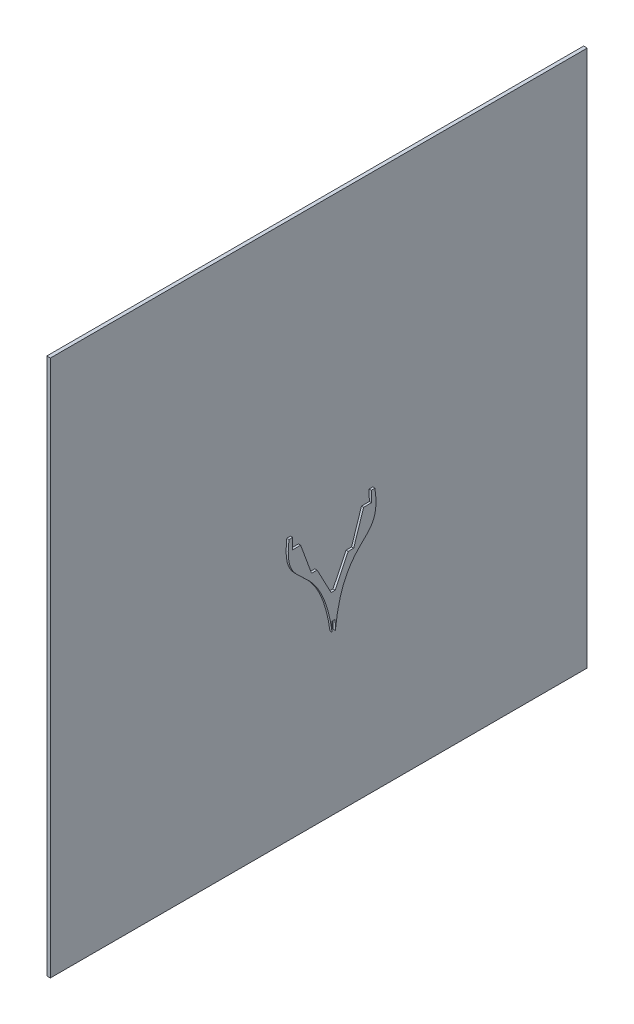
ISO-10303-21;
HEADER;
FILE_DESCRIPTION(('STEP AP214'),'2;1');
FILE_NAME('part.step','',(''),(''),'','','');
FILE_SCHEMA(('AUTOMOTIVE_DESIGN { 1 0 10303 214 1 1 1 1 }'));
ENDSEC;
DATA;
#1=APPLICATION_CONTEXT('core data for automotive mechanical design processes');
#2=APPLICATION_PROTOCOL_DEFINITION('international standard','automotive_design',2000,#1);
#3=PRODUCT_CONTEXT('',#1,'mechanical');
#4=PRODUCT('Part','Part','',(#3));
#5=PRODUCT_RELATED_PRODUCT_CATEGORY('part','',(#4));
#6=PRODUCT_DEFINITION_FORMATION('','',#4);
#7=PRODUCT_DEFINITION_CONTEXT('part definition',#1,'design');
#8=PRODUCT_DEFINITION('design','',#6,#7);
#9=PRODUCT_DEFINITION_SHAPE('','',#8);
#10=(LENGTH_UNIT() NAMED_UNIT(*) SI_UNIT(.MILLI.,.METRE.));
#11=(NAMED_UNIT(*) PLANE_ANGLE_UNIT() SI_UNIT($,.RADIAN.));
#12=(NAMED_UNIT(*) SI_UNIT($,.STERADIAN.) SOLID_ANGLE_UNIT());
#13=UNCERTAINTY_MEASURE_WITH_UNIT(LENGTH_MEASURE(1.E-05),#10,'distance_accuracy_value','');
#14=(GEOMETRIC_REPRESENTATION_CONTEXT(3) GLOBAL_UNCERTAINTY_ASSIGNED_CONTEXT((#13)) GLOBAL_UNIT_ASSIGNED_CONTEXT((#10,
#11,#12)) REPRESENTATION_CONTEXT('',''));
#15=CARTESIAN_POINT('',(0.,0.,0.));
#16=DIRECTION('',(0.,0.,1.));
#17=DIRECTION('',(1.,0.,0.));
#18=AXIS2_PLACEMENT_3D('',#15,#16,#17);
#19=CARTESIAN_POINT('',(6.,364.853833294932,126.645128026185));
#20=CARTESIAN_POINT('',(6.,189.198989555926,148.13035540186));
#21=CARTESIAN_POINT('',(6.,339.317071991358,6.14685676845281));
#22=CARTESIAN_POINT('',(6.,42.0883154100208,0.762445711713081));
#23=CARTESIAN_POINT('',(6.,0.,0.));
#24=B_SPLINE_CURVE_WITH_KNOTS('',4,(#19,#20,#21,#22,#23),.UNSPECIFIED.,.F.,.F.,(5,5),(0.,1.),.UNSPECIFIED.);
#25=DIRECTION('',(-1.,0.,0.));
#26=VECTOR('',#25,1.);
#27=SURFACE_OF_LINEAR_EXTRUSION('',#24,#26);
#28=CARTESIAN_POINT('',(0.,364.853833294932,126.645128026185));
#29=CARTESIAN_POINT('',(0.,189.198989555926,148.13035540186));
#30=CARTESIAN_POINT('',(0.,339.317071991358,6.14685676845281));
#31=CARTESIAN_POINT('',(0.,42.0883154100208,0.762445711713081));
#32=CARTESIAN_POINT('',(0.,0.,0.));
#33=B_SPLINE_CURVE_WITH_KNOTS('',4,(#28,#29,#30,#31,#32),.UNSPECIFIED.,.F.,.F.,(5,5),(0.,1.),.UNSPECIFIED.);
#34=CARTESIAN_POINT('',(0.,364.853833294932,126.645128026185));
#35=VERTEX_POINT('',#34);
#36=CARTESIAN_POINT('',(0.,79.9870890347289,5.95047304447543));
#37=VERTEX_POINT('',#36);
#38=EDGE_CURVE('E191',#35,#37,#33,.T.);
#39=ORIENTED_EDGE('',*,*,#38,.T.);
#40=DIRECTION('',(1.,0.,0.));
#41=VECTOR('',#40,1.);
#42=CARTESIAN_POINT('',(0.,79.9870890347289,5.95047304447543));
#43=LINE('',#42,#41);
#44=CARTESIAN_POINT('',(6.,79.9870890347289,5.95047304447543));
#45=VERTEX_POINT('',#44);
#46=EDGE_CURVE('E197',#37,#45,#43,.T.);
#47=ORIENTED_EDGE('',*,*,#46,.T.);
#48=CARTESIAN_POINT('',(6.,364.853833294932,126.645128026185));
#49=VERTEX_POINT('',#48);
#50=EDGE_CURVE('E231',#49,#45,#24,.T.);
#51=ORIENTED_EDGE('',*,*,#50,.F.);
#52=DIRECTION('',(-1.,0.,0.));
#53=VECTOR('',#52,1.);
#54=CARTESIAN_POINT('',(6.,364.853833294932,126.645128026185));
#55=LINE('',#54,#53);
#56=EDGE_CURVE('E187',#49,#35,#55,.T.);
#57=ORIENTED_EDGE('',*,*,#56,.T.);
#58=EDGE_LOOP('',(#39,#47,#51,#57));
#59=FACE_BOUND('',#58,.T.);
#60=ADVANCED_FACE('F45',(#59),#27,.F.);
#61=CARTESIAN_POINT('',(6.,0.,0.));
#62=CARTESIAN_POINT('',(6.,42.0883154100208,0.762445711713081));
#63=CARTESIAN_POINT('',(6.,339.317071991358,6.14685676845281));
#64=CARTESIAN_POINT('',(6.,194.439966493917,-141.180590983));
#65=CARTESIAN_POINT('',(6.,369.201389216786,-113.347440743804));
#66=B_SPLINE_CURVE_WITH_KNOTS('',4,(#61,#62,#63,#64,#65),.UNSPECIFIED.,.F.,.F.,(5,5),(0.,1.),.UNSPECIFIED.);
#67=DIRECTION('',(-1.,0.,0.));
#68=VECTOR('',#67,1.);
#69=SURFACE_OF_LINEAR_EXTRUSION('',#66,#68);
#70=CARTESIAN_POINT('',(6.,80.150127430031,-3.04952695552456));
#71=VERTEX_POINT('',#70);
#72=CARTESIAN_POINT('',(6.,369.201389216786,-113.347440743804));
#73=VERTEX_POINT('',#72);
#74=EDGE_CURVE('E128',#71,#73,#66,.T.);
#75=ORIENTED_EDGE('',*,*,#74,.F.);
#76=DIRECTION('',(1.,0.,0.));
#77=VECTOR('',#76,1.);
#78=CARTESIAN_POINT('',(0.,80.150127430031,-3.04952695552456));
#79=LINE('',#78,#77);
#80=CARTESIAN_POINT('',(0.,80.150127430031,-3.04952695552456));
#81=VERTEX_POINT('',#80);
#82=EDGE_CURVE('E323',#81,#71,#79,.T.);
#83=ORIENTED_EDGE('',*,*,#82,.F.);
#84=CARTESIAN_POINT('',(0.,0.,0.));
#85=CARTESIAN_POINT('',(0.,42.0883154100208,0.762445711713081));
#86=CARTESIAN_POINT('',(0.,339.317071991358,6.14685676845281));
#87=CARTESIAN_POINT('',(0.,194.439966493917,-141.180590983));
#88=CARTESIAN_POINT('',(0.,369.201389216786,-113.347440743804));
#89=B_SPLINE_CURVE_WITH_KNOTS('',4,(#84,#85,#86,#87,#88),.UNSPECIFIED.,.F.,.F.,(5,5),(0.,1.),.UNSPECIFIED.);
#90=CARTESIAN_POINT('',(0.,369.201389216786,-113.347440743804));
#91=VERTEX_POINT('',#90);
#92=EDGE_CURVE('E196',#81,#91,#89,.T.);
#93=ORIENTED_EDGE('',*,*,#92,.T.);
#94=DIRECTION('',(-1.,0.,0.));
#95=VECTOR('',#94,1.);
#96=CARTESIAN_POINT('',(6.,369.201389216786,-113.347440743804));
#97=LINE('',#96,#95);
#98=EDGE_CURVE('E13',#73,#91,#97,.T.);
#99=ORIENTED_EDGE('',*,*,#98,.F.);
#100=EDGE_LOOP('',(#75,#83,#93,#99));
#101=FACE_BOUND('',#100,.T.);
#102=ADVANCED_FACE('F335',(#101),#69,.F.);
#103=CARTESIAN_POINT('',(6.,369.201389216786,-113.347440743804));
#104=DIRECTION('',(0.,-0.999835956927465,-0.0181124055536444));
#105=DIRECTION('',(0.,0.0181124055536444,-0.999835956927465));
#106=AXIS2_PLACEMENT_3D('',#103,#104,#105);
#107=PLANE('',#106);
#108=DIRECTION('',(0.,-0.0181124055536444,0.999835956927465));
#109=VECTOR('',#108,1.);
#110=CARTESIAN_POINT('',(0.,369.201389216786,-113.347440743804));
#111=LINE('',#110,#109);
#112=CARTESIAN_POINT('',(0.,369.020235444228,-103.347440743804));
#113=VERTEX_POINT('',#112);
#114=EDGE_CURVE('E204',#91,#113,#111,.T.);
#115=ORIENTED_EDGE('',*,*,#114,.T.);
#116=DIRECTION('',(-1.,0.,0.));
#117=VECTOR('',#116,1.);
#118=CARTESIAN_POINT('',(6.,369.020235444228,-103.347440743804));
#119=LINE('',#118,#117);
#120=CARTESIAN_POINT('',(6.,369.020235444228,-103.347440743804));
#121=VERTEX_POINT('',#120);
#122=EDGE_CURVE('E53',#121,#113,#119,.T.);
#123=ORIENTED_EDGE('',*,*,#122,.F.);
#124=DIRECTION('',(0.,-0.0181124055536444,0.999835956927465));
#125=VECTOR('',#124,1.);
#126=CARTESIAN_POINT('',(6.,369.201389216786,-113.347440743804));
#127=LINE('',#126,#125);
#128=EDGE_CURVE('E317',#73,#121,#127,.T.);
#129=ORIENTED_EDGE('',*,*,#128,.F.);
#130=ORIENTED_EDGE('',*,*,#98,.T.);
#131=EDGE_LOOP('',(#115,#123,#129,#130));
#132=FACE_BOUND('',#131,.T.);
#133=ADVANCED_FACE('F338',(#132),#107,.F.);
#134=CARTESIAN_POINT('',(6.,369.020235444228,-103.347440743804));
#135=DIRECTION('',(0.,0.0160870411099661,-0.999870595181359));
#136=DIRECTION('',(0.,0.99987059518136,0.0160870411099661));
#137=AXIS2_PLACEMENT_3D('',#134,#135,#136);
#138=PLANE('',#137);
#139=DIRECTION('',(0.,-0.99987059518136,-0.0160870411099661));
#140=VECTOR('',#139,1.);
#141=CARTESIAN_POINT('',(0.,369.020235444228,-103.347440743804));
#142=LINE('',#141,#140);
#143=CARTESIAN_POINT('',(0.,338.725486256645,-103.834856693374));
#144=VERTEX_POINT('',#143);
#145=EDGE_CURVE('E209',#113,#144,#142,.T.);
#146=ORIENTED_EDGE('',*,*,#145,.T.);
#147=DIRECTION('',(-1.,0.,0.));
#148=VECTOR('',#147,1.);
#149=CARTESIAN_POINT('',(6.,338.725486256645,-103.834856693374));
#150=LINE('',#149,#148);
#151=CARTESIAN_POINT('',(6.,338.725486256645,-103.834856693374));
#152=VERTEX_POINT('',#151);
#153=EDGE_CURVE('E256',#152,#144,#150,.T.);
#154=ORIENTED_EDGE('',*,*,#153,.F.);
#155=DIRECTION('',(0.,-0.99987059518136,-0.0160870411099661));
#156=VECTOR('',#155,1.);
#157=CARTESIAN_POINT('',(6.,369.020235444228,-103.347440743804));
#158=LINE('',#157,#156);
#159=EDGE_CURVE('E265',#121,#152,#158,.T.);
#160=ORIENTED_EDGE('',*,*,#159,.F.);
#161=ORIENTED_EDGE('',*,*,#122,.T.);
#162=EDGE_LOOP('',(#146,#154,#160,#161));
#163=FACE_BOUND('',#162,.T.);
#164=ADVANCED_FACE('F263',(#163),#138,.F.);
#165=CARTESIAN_POINT('',(6.,338.725486256645,-103.834856693374));
#166=DIRECTION('',(0.,-0.999835956927465,-0.0181124055536395));
#167=DIRECTION('',(0.,0.0181124055536395,-0.999835956927465));
#168=AXIS2_PLACEMENT_3D('',#165,#166,#167);
#169=PLANE('',#168);
#170=DIRECTION('',(0.,-0.0181124055536395,0.999835956927465));
#171=VECTOR('',#170,1.);
#172=CARTESIAN_POINT('',(0.,338.725486256645,-103.834856693374));
#173=LINE('',#172,#171);
#174=CARTESIAN_POINT('',(0.,338.329231694482,-81.9609229315815));
#175=VERTEX_POINT('',#174);
#176=EDGE_CURVE('E211',#144,#175,#173,.T.);
#177=ORIENTED_EDGE('',*,*,#176,.T.);
#178=DIRECTION('',(-1.,0.,0.));
#179=VECTOR('',#178,1.);
#180=CARTESIAN_POINT('',(6.,338.329231694482,-81.9609229315815));
#181=LINE('',#180,#179);
#182=CARTESIAN_POINT('',(6.,338.329231694482,-81.9609229315815));
#183=VERTEX_POINT('',#182);
#184=EDGE_CURVE('E253',#183,#175,#181,.T.);
#185=ORIENTED_EDGE('',*,*,#184,.F.);
#186=DIRECTION('',(0.,-0.0181124055536395,0.999835956927465));
#187=VECTOR('',#186,1.);
#188=CARTESIAN_POINT('',(6.,338.725486256645,-103.834856693374));
#189=LINE('',#188,#187);
#190=EDGE_CURVE('E287',#152,#183,#189,.T.);
#191=ORIENTED_EDGE('',*,*,#190,.F.);
#192=ORIENTED_EDGE('',*,*,#153,.T.);
#193=EDGE_LOOP('',(#177,#185,#191,#192));
#194=FACE_BOUND('',#193,.T.);
#195=ADVANCED_FACE('F278',(#194),#169,.F.);
#196=CARTESIAN_POINT('',(6.,338.329231694482,-81.9609229315815));
#197=DIRECTION('',(0.,-0.311111308267552,-0.950373481252529));
#198=DIRECTION('',(0.,0.95037348125253,-0.311111308267552));
#199=AXIS2_PLACEMENT_3D('',#196,#197,#198);
#200=PLANE('',#199);
#201=DIRECTION('',(0.,-0.95037348125253,0.311111308267552));
#202=VECTOR('',#201,1.);
#203=CARTESIAN_POINT('',(0.,338.329231694482,-81.9609229315815));
#204=LINE('',#203,#202);
#205=CARTESIAN_POINT('',(0.,253.603564510284,-54.2253919203654));
#206=VERTEX_POINT('',#205);
#207=EDGE_CURVE('E213',#175,#206,#204,.T.);
#208=ORIENTED_EDGE('',*,*,#207,.T.);
#209=DIRECTION('',(-1.,0.,0.));
#210=VECTOR('',#209,1.);
#211=CARTESIAN_POINT('',(6.,253.603564510284,-54.2253919203654));
#212=LINE('',#211,#210);
#213=CARTESIAN_POINT('',(6.,253.603564510284,-54.2253919203654));
#214=VERTEX_POINT('',#213);
#215=EDGE_CURVE('E250',#214,#206,#212,.T.);
#216=ORIENTED_EDGE('',*,*,#215,.F.);
#217=DIRECTION('',(0.,-0.95037348125253,0.311111308267552));
#218=VECTOR('',#217,1.);
#219=CARTESIAN_POINT('',(6.,338.329231694482,-81.9609229315815));
#220=LINE('',#219,#218);
#221=EDGE_CURVE('E284',#183,#214,#220,.T.);
#222=ORIENTED_EDGE('',*,*,#221,.F.);
#223=ORIENTED_EDGE('',*,*,#184,.T.);
#224=EDGE_LOOP('',(#208,#216,#222,#223));
#225=FACE_BOUND('',#224,.T.);
#226=ADVANCED_FACE('F282',(#225),#200,.F.);
#227=CARTESIAN_POINT('',(6.,253.603564510284,-54.2253919203654));
#228=DIRECTION('',(0.,-0.999835956927465,-0.0181124055536461));
#229=DIRECTION('',(0.,0.0181124055536461,-0.999835956927465));
#230=AXIS2_PLACEMENT_3D('',#227,#228,#229);
#231=PLANE('',#230);
#232=DIRECTION('',(0.,-0.0181124055536461,0.999835956927465));
#233=VECTOR('',#232,1.);
#234=CARTESIAN_POINT('',(0.,253.603564510284,-54.2253919203654));
#235=LINE('',#234,#233);
#236=CARTESIAN_POINT('',(0.,253.325986756832,-38.9026222351012));
#237=VERTEX_POINT('',#236);
#238=EDGE_CURVE('E215',#206,#237,#235,.T.);
#239=ORIENTED_EDGE('',*,*,#238,.T.);
#240=DIRECTION('',(-1.,0.,0.));
#241=VECTOR('',#240,1.);
#242=CARTESIAN_POINT('',(6.,253.325986756832,-38.9026222351012));
#243=LINE('',#242,#241);
#244=CARTESIAN_POINT('',(6.,253.325986756832,-38.9026222351012));
#245=VERTEX_POINT('',#244);
#246=EDGE_CURVE('E247',#245,#237,#243,.T.);
#247=ORIENTED_EDGE('',*,*,#246,.F.);
#248=DIRECTION('',(0.,-0.0181124055536461,0.999835956927465));
#249=VECTOR('',#248,1.);
#250=CARTESIAN_POINT('',(6.,253.603564510284,-54.2253919203654));
#251=LINE('',#250,#249);
#252=EDGE_CURVE('E286',#214,#245,#251,.T.);
#253=ORIENTED_EDGE('',*,*,#252,.F.);
#254=ORIENTED_EDGE('',*,*,#215,.T.);
#255=EDGE_LOOP('',(#239,#247,#253,#254));
#256=FACE_BOUND('',#255,.T.);
#257=ADVANCED_FACE('F348',(#256),#231,.F.);
#258=CARTESIAN_POINT('',(6.,253.325986756832,-38.9026222351012));
#259=DIRECTION('',(0.,-0.435133768076451,-0.90036581669874));
#260=DIRECTION('',(0.,0.90036581669874,-0.435133768076451));
#261=AXIS2_PLACEMENT_3D('',#258,#259,#260);
#262=PLANE('',#261);
#263=DIRECTION('',(0.,-0.90036581669874,0.435133768076451));
#264=VECTOR('',#263,1.);
#265=CARTESIAN_POINT('',(0.,253.325986756832,-38.9026222351012));
#266=LINE('',#265,#264);
#267=CARTESIAN_POINT('',(0.,177.902642332424,-2.45161148854171));
#268=VERTEX_POINT('',#267);
#269=EDGE_CURVE('E217',#237,#268,#266,.T.);
#270=ORIENTED_EDGE('',*,*,#269,.T.);
#271=DIRECTION('',(-1.,0.,0.));
#272=VECTOR('',#271,1.);
#273=CARTESIAN_POINT('',(6.,177.902642332424,-2.45161148854171));
#274=LINE('',#273,#272);
#275=CARTESIAN_POINT('',(6.,177.902642332424,-2.45161148854171));
#276=VERTEX_POINT('',#275);
#277=EDGE_CURVE('E244',#276,#268,#274,.T.);
#278=ORIENTED_EDGE('',*,*,#277,.F.);
#279=DIRECTION('',(0.,-0.90036581669874,0.435133768076451));
#280=VECTOR('',#279,1.);
#281=CARTESIAN_POINT('',(6.,253.325986756832,-38.9026222351012));
#282=LINE('',#281,#280);
#283=EDGE_CURVE('E289',#245,#276,#282,.T.);
#284=ORIENTED_EDGE('',*,*,#283,.F.);
#285=ORIENTED_EDGE('',*,*,#246,.T.);
#286=EDGE_LOOP('',(#270,#278,#284,#285));
#287=FACE_BOUND('',#286,.T.);
#288=ADVANCED_FACE('F351',(#287),#262,.F.);
#289=CARTESIAN_POINT('',(6.,177.902642332424,-2.45161148854171));
#290=DIRECTION('',(0.,-0.999835956927465,-0.0181124055536434));
#291=DIRECTION('',(0.,0.0181124055536434,-0.999835956927466));
#292=AXIS2_PLACEMENT_3D('',#289,#290,#291);
#293=PLANE('',#292);
#294=DIRECTION('',(0.,-0.0181124055536434,0.999835956927466));
#295=VECTOR('',#294,1.);
#296=CARTESIAN_POINT('',(0.,177.902642332424,-2.45161148854171));
#297=LINE('',#296,#295);
#298=CARTESIAN_POINT('',(0.,177.697122528397,8.89343538106488));
#299=VERTEX_POINT('',#298);
#300=EDGE_CURVE('E219',#268,#299,#297,.T.);
#301=ORIENTED_EDGE('',*,*,#300,.T.);
#302=DIRECTION('',(-1.,0.,0.));
#303=VECTOR('',#302,1.);
#304=CARTESIAN_POINT('',(6.,177.697122528397,8.89343538106488));
#305=LINE('',#304,#303);
#306=CARTESIAN_POINT('',(6.,177.697122528397,8.89343538106488));
#307=VERTEX_POINT('',#306);
#308=EDGE_CURVE('E241',#307,#299,#305,.T.);
#309=ORIENTED_EDGE('',*,*,#308,.F.);
#310=DIRECTION('',(0.,-0.0181124055536434,0.999835956927466));
#311=VECTOR('',#310,1.);
#312=CARTESIAN_POINT('',(6.,177.902642332424,-2.45161148854171));
#313=LINE('',#312,#311);
#314=EDGE_CURVE('E295',#276,#307,#313,.T.);
#315=ORIENTED_EDGE('',*,*,#314,.F.);
#316=ORIENTED_EDGE('',*,*,#277,.T.);
#317=EDGE_LOOP('',(#301,#309,#315,#316));
#318=FACE_BOUND('',#317,.T.);
#319=ADVANCED_FACE('F355',(#318),#293,.F.);
#320=CARTESIAN_POINT('',(6.,251.750765932059,48.0522781531887));
#321=DIRECTION('',(0.,-0.467458500051491,0.884015017253446));
#322=DIRECTION('',(0.,-0.884015017253446,-0.467458500051491));
#323=AXIS2_PLACEMENT_3D('',#320,#321,#322);
#324=PLANE('',#323);
#325=DIRECTION('',(0.,0.884015017253446,0.467458500051491));
#326=VECTOR('',#325,1.);
#327=CARTESIAN_POINT('',(0.,251.750765932059,48.0522781531887));
#328=LINE('',#327,#326);
#329=CARTESIAN_POINT('',(0.,251.750765932059,48.0522781531887));
#330=VERTEX_POINT('',#329);
#331=EDGE_CURVE('E221',#299,#330,#328,.T.);
#332=ORIENTED_EDGE('',*,*,#331,.T.);
#333=DIRECTION('',(-1.,0.,0.));
#334=VECTOR('',#333,1.);
#335=CARTESIAN_POINT('',(6.,251.750765932059,48.0522781531887));
#336=LINE('',#335,#334);
#337=CARTESIAN_POINT('',(6.,251.750765932059,48.0522781531887));
#338=VERTEX_POINT('',#337);
#339=EDGE_CURVE('E238',#338,#330,#336,.T.);
#340=ORIENTED_EDGE('',*,*,#339,.F.);
#341=DIRECTION('',(0.,0.884015017253446,0.467458500051491));
#342=VECTOR('',#341,1.);
#343=CARTESIAN_POINT('',(6.,251.750765932059,48.0522781531887));
#344=LINE('',#343,#342);
#345=EDGE_CURVE('E297',#307,#338,#344,.T.);
#346=ORIENTED_EDGE('',*,*,#345,.F.);
#347=ORIENTED_EDGE('',*,*,#308,.T.);
#348=EDGE_LOOP('',(#332,#340,#346,#347));
#349=FACE_BOUND('',#348,.T.);
#350=ADVANCED_FACE('F359',(#349),#324,.F.);
#351=CARTESIAN_POINT('',(6.,251.473188178607,63.3750478384528));
#352=DIRECTION('',(0.,-0.999835956927465,-0.0181124055536425));
#353=DIRECTION('',(0.,0.0181124055536425,-0.999835956927466));
#354=AXIS2_PLACEMENT_3D('',#351,#352,#353);
#355=PLANE('',#354);
#356=DIRECTION('',(0.,-0.0181124055536425,0.999835956927465));
#357=VECTOR('',#356,1.);
#358=CARTESIAN_POINT('',(0.,251.473188178607,63.3750478384528));
#359=LINE('',#358,#357);
#360=CARTESIAN_POINT('',(0.,251.473188178607,63.3750478384528));
#361=VERTEX_POINT('',#360);
#362=EDGE_CURVE('E223',#330,#361,#359,.T.);
#363=ORIENTED_EDGE('',*,*,#362,.T.);
#364=DIRECTION('',(-1.,0.,0.));
#365=VECTOR('',#364,1.);
#366=CARTESIAN_POINT('',(6.,251.473188178607,63.3750478384528));
#367=LINE('',#366,#365);
#368=CARTESIAN_POINT('',(6.,251.473188178607,63.3750478384528));
#369=VERTEX_POINT('',#368);
#370=EDGE_CURVE('E235',#369,#361,#367,.T.);
#371=ORIENTED_EDGE('',*,*,#370,.F.);
#372=DIRECTION('',(0.,-0.0181124055536425,0.999835956927465));
#373=VECTOR('',#372,1.);
#374=CARTESIAN_POINT('',(6.,251.473188178607,63.3750478384528));
#375=LINE('',#374,#373);
#376=EDGE_CURVE('E299',#338,#369,#375,.T.);
#377=ORIENTED_EDGE('',*,*,#376,.F.);
#378=ORIENTED_EDGE('',*,*,#339,.T.);
#379=EDGE_LOOP('',(#363,#371,#377,#378));
#380=FACE_BOUND('',#379,.T.);
#381=ADVANCED_FACE('F305',(#380),#355,.F.);
#382=CARTESIAN_POINT('',(6.,335.138715732283,94.1610488688984));
#383=DIRECTION('',(0.,-0.34532863470452,0.938481824039822));
#384=DIRECTION('',(0.,-0.938481824039823,-0.34532863470452));
#385=AXIS2_PLACEMENT_3D('',#382,#383,#384);
#386=PLANE('',#385);
#387=DIRECTION('',(0.,0.938481824039822,0.34532863470452));
#388=VECTOR('',#387,1.);
#389=CARTESIAN_POINT('',(0.,335.138715732283,94.1610488688984));
#390=LINE('',#389,#388);
#391=CARTESIAN_POINT('',(0.,335.138715732283,94.1610488688984));
#392=VERTEX_POINT('',#391);
#393=EDGE_CURVE('E225',#361,#392,#390,.T.);
#394=ORIENTED_EDGE('',*,*,#393,.T.);
#395=DIRECTION('',(-1.,0.,0.));
#396=VECTOR('',#395,1.);
#397=CARTESIAN_POINT('',(6.,335.138715732283,94.1610488688984));
#398=LINE('',#397,#396);
#399=CARTESIAN_POINT('',(6.,335.138715732283,94.1610488688984));
#400=VERTEX_POINT('',#399);
#401=EDGE_CURVE('E182',#400,#392,#398,.T.);
#402=ORIENTED_EDGE('',*,*,#401,.F.);
#403=DIRECTION('',(0.,0.938481824039822,0.34532863470452));
#404=VECTOR('',#403,1.);
#405=CARTESIAN_POINT('',(6.,335.138715732283,94.1610488688984));
#406=LINE('',#405,#404);
#407=EDGE_CURVE('E170',#369,#400,#406,.T.);
#408=ORIENTED_EDGE('',*,*,#407,.F.);
#409=ORIENTED_EDGE('',*,*,#370,.T.);
#410=EDGE_LOOP('',(#394,#402,#408,#409));
#411=FACE_BOUND('',#410,.T.);
#412=ADVANCED_FACE('F309',(#411),#386,.F.);
#413=CARTESIAN_POINT('',(6.,334.74246117012,116.034982630691));
#414=DIRECTION('',(0.,-0.999835956927465,-0.0181124055536446));
#415=DIRECTION('',(0.,0.0181124055536446,-0.999835956927465));
#416=AXIS2_PLACEMENT_3D('',#413,#414,#415);
#417=PLANE('',#416);
#418=DIRECTION('',(0.,-0.0181124055536446,0.999835956927465));
#419=VECTOR('',#418,1.);
#420=CARTESIAN_POINT('',(0.,334.74246117012,116.034982630691));
#421=LINE('',#420,#419);
#422=CARTESIAN_POINT('',(0.,334.74246117012,116.034982630691));
#423=VERTEX_POINT('',#422);
#424=EDGE_CURVE('E179',#392,#423,#421,.T.);
#425=ORIENTED_EDGE('',*,*,#424,.T.);
#426=DIRECTION('',(-1.,0.,0.));
#427=VECTOR('',#426,1.);
#428=CARTESIAN_POINT('',(6.,334.74246117012,116.034982630691));
#429=LINE('',#428,#427);
#430=CARTESIAN_POINT('',(6.,334.74246117012,116.034982630691));
#431=VERTEX_POINT('',#430);
#432=EDGE_CURVE('E176',#431,#423,#429,.T.);
#433=ORIENTED_EDGE('',*,*,#432,.F.);
#434=DIRECTION('',(0.,-0.0181124055536446,0.999835956927465));
#435=VECTOR('',#434,1.);
#436=CARTESIAN_POINT('',(6.,334.74246117012,116.034982630691));
#437=LINE('',#436,#435);
#438=EDGE_CURVE('E163',#400,#431,#437,.T.);
#439=ORIENTED_EDGE('',*,*,#438,.F.);
#440=ORIENTED_EDGE('',*,*,#401,.T.);
#441=EDGE_LOOP('',(#425,#433,#439,#440));
#442=FACE_BOUND('',#441,.T.);
#443=ADVANCED_FACE('F177',(#442),#417,.F.);
#444=CARTESIAN_POINT('',(6.,365.03498706749,116.645128026186));
#445=DIRECTION('',(0.,-0.0201376956766726,0.999797216045751));
#446=DIRECTION('',(0.,-0.999797216045751,-0.0201376956766726));
#447=AXIS2_PLACEMENT_3D('',#444,#445,#446);
#448=PLANE('',#447);
#449=DIRECTION('',(0.,0.999797216045751,0.0201376956766726));
#450=VECTOR('',#449,1.);
#451=CARTESIAN_POINT('',(0.,365.03498706749,116.645128026186));
#452=LINE('',#451,#450);
#453=CARTESIAN_POINT('',(0.,365.03498706749,116.645128026186));
#454=VERTEX_POINT('',#453);
#455=EDGE_CURVE('E228',#423,#454,#452,.T.);
#456=ORIENTED_EDGE('',*,*,#455,.T.);
#457=DIRECTION('',(-1.,0.,0.));
#458=VECTOR('',#457,1.);
#459=CARTESIAN_POINT('',(6.,365.03498706749,116.645128026186));
#460=LINE('',#459,#458);
#461=CARTESIAN_POINT('',(6.,365.03498706749,116.645128026186));
#462=VERTEX_POINT('',#461);
#463=EDGE_CURVE('E183',#462,#454,#460,.T.);
#464=ORIENTED_EDGE('',*,*,#463,.F.);
#465=DIRECTION('',(0.,0.999797216045751,0.0201376956766726));
#466=VECTOR('',#465,1.);
#467=CARTESIAN_POINT('',(6.,365.03498706749,116.645128026186));
#468=LINE('',#467,#466);
#469=EDGE_CURVE('E167',#431,#462,#468,.T.);
#470=ORIENTED_EDGE('',*,*,#469,.F.);
#471=ORIENTED_EDGE('',*,*,#432,.T.);
#472=EDGE_LOOP('',(#456,#464,#470,#471));
#473=FACE_BOUND('',#472,.T.);
#474=ADVANCED_FACE('F185',(#473),#448,.F.);
#475=CARTESIAN_POINT('',(6.,364.853833294932,126.645128026185));
#476=DIRECTION('',(0.,-0.999835956927465,-0.0181124055536447));
#477=DIRECTION('',(0.,0.0181124055536447,-0.999835956927465));
#478=AXIS2_PLACEMENT_3D('',#475,#476,#477);
#479=PLANE('',#478);
#480=DIRECTION('',(0.,-0.0181124055536447,0.999835956927465));
#481=VECTOR('',#480,1.);
#482=CARTESIAN_POINT('',(0.,364.853833294932,126.645128026185));
#483=LINE('',#482,#481);
#484=EDGE_CURVE('E120',#454,#35,#483,.T.);
#485=ORIENTED_EDGE('',*,*,#484,.T.);
#486=ORIENTED_EDGE('',*,*,#56,.F.);
#487=DIRECTION('',(0.,-0.0181124055536447,0.999835956927465));
#488=VECTOR('',#487,1.);
#489=CARTESIAN_POINT('',(6.,364.853833294932,126.645128026185));
#490=LINE('',#489,#488);
#491=EDGE_CURVE('E69',#462,#49,#490,.T.);
#492=ORIENTED_EDGE('',*,*,#491,.F.);
#493=ORIENTED_EDGE('',*,*,#463,.T.);
#494=EDGE_LOOP('',(#485,#486,#492,#493));
#495=FACE_BOUND('',#494,.T.);
#496=ADVANCED_FACE('F311',(#495),#479,.F.);
#497=CARTESIAN_POINT('',(6.,207.869092819179,47.4435920681996));
#498=DIRECTION('',(-1.,0.,0.));
#499=DIRECTION('',(0.,0.,1.));
#500=AXIS2_PLACEMENT_3D('',#497,#498,#499);
#501=PLANE('',#500);
#502=ORIENTED_EDGE('',*,*,#50,.T.);
#503=DIRECTION('',(0.,-0.999835956927465,-0.0181124055536429));
#504=VECTOR('',#503,1.);
#505=CARTESIAN_POINT('',(6.,79.9870890347289,5.95047304447543));
#506=LINE('',#505,#504);
#507=CARTESIAN_POINT('',(6.,106.987089034729,6.43958823038171));
#508=VERTEX_POINT('',#507);
#509=EDGE_CURVE('E511',#508,#45,#506,.T.);
#510=ORIENTED_EDGE('',*,*,#509,.F.);
#511=DIRECTION('',(0.,-0.0181124055536438,0.999835956927465));
#512=VECTOR('',#511,1.);
#513=CARTESIAN_POINT('',(6.,106.987089034729,6.43958823038171));
#514=LINE('',#513,#512);
#515=CARTESIAN_POINT('',(6.,107.150127430031,-2.56041176961829));
#516=VERTEX_POINT('',#515);
#517=EDGE_CURVE('E519',#516,#508,#514,.T.);
#518=ORIENTED_EDGE('',*,*,#517,.F.);
#519=DIRECTION('',(0.,0.999835956927465,0.0181124055536428));
#520=VECTOR('',#519,1.);
#521=CARTESIAN_POINT('',(6.,107.150127430031,-2.56041176961829));
#522=LINE('',#521,#520);
#523=EDGE_CURVE('E523',#71,#516,#522,.T.);
#524=ORIENTED_EDGE('',*,*,#523,.F.);
#525=ORIENTED_EDGE('',*,*,#74,.T.);
#526=ORIENTED_EDGE('',*,*,#128,.T.);
#527=ORIENTED_EDGE('',*,*,#159,.T.);
#528=ORIENTED_EDGE('',*,*,#190,.T.);
#529=ORIENTED_EDGE('',*,*,#221,.T.);
#530=ORIENTED_EDGE('',*,*,#252,.T.);
#531=ORIENTED_EDGE('',*,*,#283,.T.);
#532=ORIENTED_EDGE('',*,*,#314,.T.);
#533=ORIENTED_EDGE('',*,*,#345,.T.);
#534=ORIENTED_EDGE('',*,*,#376,.T.);
#535=ORIENTED_EDGE('',*,*,#407,.T.);
#536=ORIENTED_EDGE('',*,*,#438,.T.);
#537=ORIENTED_EDGE('',*,*,#469,.T.);
#538=ORIENTED_EDGE('',*,*,#491,.T.);
#539=EDGE_LOOP('',(#502,#510,#518,#524,#525,#526,#527,#528,#529,#530,#531,#532,#533,#534,#535,
#536,#537,#538));
#540=FACE_BOUND('',#539,.T.);
#541=ADVANCED_FACE('F165',(#540),#501,.F.);
#542=CARTESIAN_POINT('',(0.,207.869092819179,47.4435920681996));
#543=DIRECTION('',(-1.,0.,0.));
#544=DIRECTION('',(0.,0.,1.));
#545=AXIS2_PLACEMENT_3D('',#542,#543,#544);
#546=PLANE('',#545);
#547=DIRECTION('',(0.,-0.999835956927465,-0.0181124055536429));
#548=VECTOR('',#547,1.);
#549=CARTESIAN_POINT('',(0.,79.9870890347289,5.95047304447543));
#550=LINE('',#549,#548);
#551=CARTESIAN_POINT('',(0.,106.987089034729,6.43958823038171));
#552=VERTEX_POINT('',#551);
#553=EDGE_CURVE('E532',#552,#37,#550,.T.);
#554=ORIENTED_EDGE('',*,*,#553,.T.);
#555=ORIENTED_EDGE('',*,*,#38,.F.);
#556=ORIENTED_EDGE('',*,*,#484,.F.);
#557=ORIENTED_EDGE('',*,*,#455,.F.);
#558=ORIENTED_EDGE('',*,*,#424,.F.);
#559=ORIENTED_EDGE('',*,*,#393,.F.);
#560=ORIENTED_EDGE('',*,*,#362,.F.);
#561=ORIENTED_EDGE('',*,*,#331,.F.);
#562=ORIENTED_EDGE('',*,*,#300,.F.);
#563=ORIENTED_EDGE('',*,*,#269,.F.);
#564=ORIENTED_EDGE('',*,*,#238,.F.);
#565=ORIENTED_EDGE('',*,*,#207,.F.);
#566=ORIENTED_EDGE('',*,*,#176,.F.);
#567=ORIENTED_EDGE('',*,*,#145,.F.);
#568=ORIENTED_EDGE('',*,*,#114,.F.);
#569=ORIENTED_EDGE('',*,*,#92,.F.);
#570=DIRECTION('',(0.,0.999835956927465,0.0181124055536428));
#571=VECTOR('',#570,1.);
#572=CARTESIAN_POINT('',(0.,107.150127430031,-2.56041176961829));
#573=LINE('',#572,#571);
#574=CARTESIAN_POINT('',(0.,107.150127430031,-2.56041176961828));
#575=VERTEX_POINT('',#574);
#576=EDGE_CURVE('E518',#81,#575,#573,.T.);
#577=ORIENTED_EDGE('',*,*,#576,.T.);
#578=DIRECTION('',(0.,-0.0181124055536438,0.999835956927465));
#579=VECTOR('',#578,1.);
#580=CARTESIAN_POINT('',(0.,106.987089034729,6.43958823038171));
#581=LINE('',#580,#579);
#582=EDGE_CURVE('E60',#575,#552,#581,.T.);
#583=ORIENTED_EDGE('',*,*,#582,.T.);
#584=EDGE_LOOP('',(#554,#555,#556,#557,#558,#559,#560,#561,#562,#563,#564,#565,#566,#567,#568,
#569,#577,#583));
#585=FACE_BOUND('',#584,.T.);
#586=ADVANCED_FACE('F272',(#585),#546,.T.);
#587=CARTESIAN_POINT('',(0.,79.9870890347289,5.95047304447543));
#588=DIRECTION('',(0.,-0.0181124055536429,0.999835956927465));
#589=DIRECTION('',(0.,-0.999835956927466,-0.0181124055536429));
#590=AXIS2_PLACEMENT_3D('',#587,#588,#589);
#591=PLANE('',#590);
#592=ORIENTED_EDGE('',*,*,#509,.T.);
#593=ORIENTED_EDGE('',*,*,#46,.F.);
#594=ORIENTED_EDGE('',*,*,#553,.F.);
#595=DIRECTION('',(1.,0.,0.));
#596=VECTOR('',#595,1.);
#597=CARTESIAN_POINT('',(0.,106.987089034729,6.43958823038171));
#598=LINE('',#597,#596);
#599=EDGE_CURVE('E514',#552,#508,#598,.T.);
#600=ORIENTED_EDGE('',*,*,#599,.T.);
#601=EDGE_LOOP('',(#592,#593,#594,#600));
#602=FACE_BOUND('',#601,.T.);
#603=ADVANCED_FACE('F376',(#602),#591,.F.);
#604=CARTESIAN_POINT('',(0.,106.987089034729,6.43958823038171));
#605=DIRECTION('',(0.,0.999835956927465,0.0181124055536438));
#606=DIRECTION('',(0.,-0.0181124055536438,0.999835956927466));
#607=AXIS2_PLACEMENT_3D('',#604,#605,#606);
#608=PLANE('',#607);
#609=ORIENTED_EDGE('',*,*,#517,.T.);
#610=ORIENTED_EDGE('',*,*,#599,.F.);
#611=ORIENTED_EDGE('',*,*,#582,.F.);
#612=DIRECTION('',(1.,0.,0.));
#613=VECTOR('',#612,1.);
#614=CARTESIAN_POINT('',(0.,107.150127430031,-2.56041176961829));
#615=LINE('',#614,#613);
#616=EDGE_CURVE('E528',#575,#516,#615,.T.);
#617=ORIENTED_EDGE('',*,*,#616,.T.);
#618=EDGE_LOOP('',(#609,#610,#611,#617));
#619=FACE_BOUND('',#618,.T.);
#620=ADVANCED_FACE('F382',(#619),#608,.F.);
#621=CARTESIAN_POINT('',(0.,107.150127430031,-2.56041176961829));
#622=DIRECTION('',(0.,0.0181124055536428,-0.999835956927465));
#623=DIRECTION('',(0.,0.999835956927466,0.0181124055536428));
#624=AXIS2_PLACEMENT_3D('',#621,#622,#623);
#625=PLANE('',#624);
#626=ORIENTED_EDGE('',*,*,#523,.T.);
#627=ORIENTED_EDGE('',*,*,#616,.F.);
#628=ORIENTED_EDGE('',*,*,#576,.F.);
#629=ORIENTED_EDGE('',*,*,#82,.T.);
#630=EDGE_LOOP('',(#626,#627,#628,#629));
#631=FACE_BOUND('',#630,.T.);
#632=ADVANCED_FACE('F379',(#631),#625,.F.);
#633=CLOSED_SHELL('',(#60,#102,#133,#164,#195,#226,#257,#288,#319,#350,#381,#412,#443,#474,#496,
#541,#586,#603,#620,#632));
#634=MANIFOLD_SOLID_BREP('B2',#633);
#635=CARTESIAN_POINT('',(-10.,0.,0.));
#636=DIRECTION('',(-1.,0.,0.));
#637=DIRECTION('',(0.,0.,1.));
#638=AXIS2_PLACEMENT_3D('',#635,#636,#637);
#639=PLANE('',#638);
#640=DIRECTION('',(0.,0.,-1.));
#641=VECTOR('',#640,1.);
#642=CARTESIAN_POINT('',(-10.,-378.710653275796,777.274991403029));
#643=LINE('',#642,#641);
#644=CARTESIAN_POINT('',(-10.,-378.710653275796,777.274991403029));
#645=VERTEX_POINT('',#644);
#646=CARTESIAN_POINT('',(-10.,-378.710653275796,-722.725008596971));
#647=VERTEX_POINT('',#646);
#648=EDGE_CURVE('E565',#645,#647,#643,.T.);
#649=ORIENTED_EDGE('',*,*,#648,.T.);
#650=DIRECTION('',(0.,-1.,0.));
#651=VECTOR('',#650,1.);
#652=CARTESIAN_POINT('',(-10.,1121.2893467242,-722.725008596971));
#653=LINE('',#652,#651);
#654=CARTESIAN_POINT('',(-10.,1121.2893467242,-722.725008596971));
#655=VERTEX_POINT('',#654);
#656=EDGE_CURVE('E599',#655,#647,#653,.T.);
#657=ORIENTED_EDGE('',*,*,#656,.F.);
#658=DIRECTION('',(0.,0.,-1.));
#659=VECTOR('',#658,1.);
#660=CARTESIAN_POINT('',(-10.,1121.2893467242,777.274991403029));
#661=LINE('',#660,#659);
#662=CARTESIAN_POINT('',(-10.,1121.2893467242,777.274991403029));
#663=VERTEX_POINT('',#662);
#664=EDGE_CURVE('E596',#663,#655,#661,.T.);
#665=ORIENTED_EDGE('',*,*,#664,.F.);
#666=DIRECTION('',(0.,-1.,0.));
#667=VECTOR('',#666,1.);
#668=CARTESIAN_POINT('',(-10.,1121.2893467242,777.274991403029));
#669=LINE('',#668,#667);
#670=EDGE_CURVE('E593',#663,#645,#669,.T.);
#671=ORIENTED_EDGE('',*,*,#670,.T.);
#672=EDGE_LOOP('',(#649,#657,#665,#671));
#673=FACE_BOUND('',#672,.T.);
#674=ADVANCED_FACE('F556',(#673),#639,.F.);
#675=CARTESIAN_POINT('',(-20.,0.,0.));
#676=DIRECTION('',(-1.,0.,0.));
#677=DIRECTION('',(0.,0.,1.));
#678=AXIS2_PLACEMENT_3D('',#675,#676,#677);
#679=PLANE('',#678);
#680=DIRECTION('',(0.,0.,-1.));
#681=VECTOR('',#680,1.);
#682=CARTESIAN_POINT('',(-20.,-378.710653275796,777.274991403029));
#683=LINE('',#682,#681);
#684=CARTESIAN_POINT('',(-20.,-378.710653275796,777.274991403029));
#685=VERTEX_POINT('',#684);
#686=CARTESIAN_POINT('',(-20.,-378.710653275796,-722.725008596971));
#687=VERTEX_POINT('',#686);
#688=EDGE_CURVE('E43',#685,#687,#683,.T.);
#689=ORIENTED_EDGE('',*,*,#688,.F.);
#690=DIRECTION('',(0.,-1.,0.));
#691=VECTOR('',#690,1.);
#692=CARTESIAN_POINT('',(-20.,1121.2893467242,777.274991403029));
#693=LINE('',#692,#691);
#694=CARTESIAN_POINT('',(-20.,1121.2893467242,777.274991403029));
#695=VERTEX_POINT('',#694);
#696=EDGE_CURVE('E612',#695,#685,#693,.T.);
#697=ORIENTED_EDGE('',*,*,#696,.F.);
#698=DIRECTION('',(0.,0.,-1.));
#699=VECTOR('',#698,1.);
#700=CARTESIAN_POINT('',(-20.,1121.2893467242,777.274991403029));
#701=LINE('',#700,#699);
#702=CARTESIAN_POINT('',(-20.,1121.2893467242,-722.725008596971));
#703=VERTEX_POINT('',#702);
#704=EDGE_CURVE('E603',#695,#703,#701,.T.);
#705=ORIENTED_EDGE('',*,*,#704,.T.);
#706=DIRECTION('',(0.,-1.,0.));
#707=VECTOR('',#706,1.);
#708=CARTESIAN_POINT('',(-20.,1121.2893467242,-722.725008596971));
#709=LINE('',#708,#707);
#710=EDGE_CURVE('E574',#703,#687,#709,.T.);
#711=ORIENTED_EDGE('',*,*,#710,.T.);
#712=EDGE_LOOP('',(#689,#697,#705,#711));
#713=FACE_BOUND('',#712,.T.);
#714=ADVANCED_FACE('F652',(#713),#679,.T.);
#715=CARTESIAN_POINT('',(-20.,1121.2893467242,777.274991403029));
#716=DIRECTION('',(0.,0.,1.));
#717=DIRECTION('',(1.,0.,0.));
#718=AXIS2_PLACEMENT_3D('',#715,#716,#717);
#719=PLANE('',#718);
#720=ORIENTED_EDGE('',*,*,#670,.F.);
#721=DIRECTION('',(1.,0.,0.));
#722=VECTOR('',#721,1.);
#723=CARTESIAN_POINT('',(-20.,1121.2893467242,777.274991403029));
#724=LINE('',#723,#722);
#725=EDGE_CURVE('E608',#695,#663,#724,.T.);
#726=ORIENTED_EDGE('',*,*,#725,.F.);
#727=ORIENTED_EDGE('',*,*,#696,.T.);
#728=DIRECTION('',(1.,0.,0.));
#729=VECTOR('',#728,1.);
#730=CARTESIAN_POINT('',(-20.,-378.710653275796,777.274991403029));
#731=LINE('',#730,#729);
#732=EDGE_CURVE('E604',#685,#645,#731,.T.);
#733=ORIENTED_EDGE('',*,*,#732,.T.);
#734=EDGE_LOOP('',(#720,#726,#727,#733));
#735=FACE_BOUND('',#734,.T.);
#736=ADVANCED_FACE('F613',(#735),#719,.T.);
#737=CARTESIAN_POINT('',(-20.,-378.710653275796,777.274991403029));
#738=DIRECTION('',(0.,-1.,0.));
#739=DIRECTION('',(0.,0.,-1.));
#740=AXIS2_PLACEMENT_3D('',#737,#738,#739);
#741=PLANE('',#740);
#742=ORIENTED_EDGE('',*,*,#648,.F.);
#743=ORIENTED_EDGE('',*,*,#732,.F.);
#744=ORIENTED_EDGE('',*,*,#688,.T.);
#745=DIRECTION('',(1.,0.,0.));
#746=VECTOR('',#745,1.);
#747=CARTESIAN_POINT('',(-20.,-378.710653275796,-722.725008596971));
#748=LINE('',#747,#746);
#749=EDGE_CURVE('E624',#687,#647,#748,.T.);
#750=ORIENTED_EDGE('',*,*,#749,.T.);
#751=EDGE_LOOP('',(#742,#743,#744,#750));
#752=FACE_BOUND('',#751,.T.);
#753=ADVANCED_FACE('F654',(#752),#741,.T.);
#754=CARTESIAN_POINT('',(-20.,1121.2893467242,777.274991403029));
#755=DIRECTION('',(0.,-1.,0.));
#756=DIRECTION('',(0.,0.,-1.));
#757=AXIS2_PLACEMENT_3D('',#754,#755,#756);
#758=PLANE('',#757);
#759=ORIENTED_EDGE('',*,*,#664,.T.);
#760=DIRECTION('',(1.,0.,0.));
#761=VECTOR('',#760,1.);
#762=CARTESIAN_POINT('',(-20.,1121.2893467242,-722.725008596971));
#763=LINE('',#762,#761);
#764=EDGE_CURVE('E628',#703,#655,#763,.T.);
#765=ORIENTED_EDGE('',*,*,#764,.F.);
#766=ORIENTED_EDGE('',*,*,#704,.F.);
#767=ORIENTED_EDGE('',*,*,#725,.T.);
#768=EDGE_LOOP('',(#759,#765,#766,#767));
#769=FACE_BOUND('',#768,.T.);
#770=ADVANCED_FACE('F609',(#769),#758,.F.);
#771=CARTESIAN_POINT('',(-20.,1121.2893467242,-722.725008596971));
#772=DIRECTION('',(0.,0.,1.));
#773=DIRECTION('',(1.,0.,0.));
#774=AXIS2_PLACEMENT_3D('',#771,#772,#773);
#775=PLANE('',#774);
#776=ORIENTED_EDGE('',*,*,#656,.T.);
#777=ORIENTED_EDGE('',*,*,#749,.F.);
#778=ORIENTED_EDGE('',*,*,#710,.F.);
#779=ORIENTED_EDGE('',*,*,#764,.T.);
#780=EDGE_LOOP('',(#776,#777,#778,#779));
#781=FACE_BOUND('',#780,.T.);
#782=ADVANCED_FACE('F639',(#781),#775,.F.);
#783=CLOSED_SHELL('',(#674,#714,#736,#753,#770,#782));
#784=MANIFOLD_SOLID_BREP('B7_NOT_SHOWN',#783);
#785=ADVANCED_BREP_SHAPE_REPRESENTATION('',(#18,#634,#784),#14);
#786=SHAPE_DEFINITION_REPRESENTATION(#9,#785);
ENDSEC;
END-ISO-10303-21;
